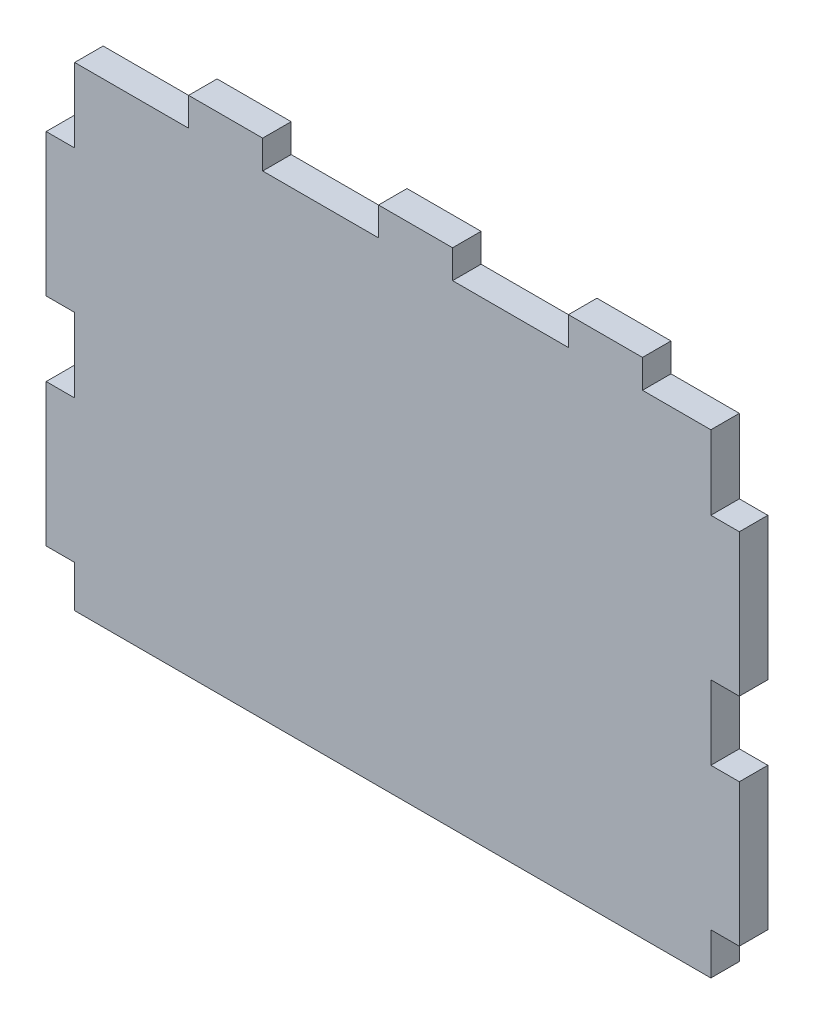
ISO-10303-21;
HEADER;
FILE_DESCRIPTION(('STEP AP214'),'2;1');
FILE_NAME('part.step','',(''),(''),'','','');
FILE_SCHEMA(('AUTOMOTIVE_DESIGN { 1 0 10303 214 1 1 1 1 }'));
ENDSEC;
DATA;
#1=APPLICATION_CONTEXT('core data for automotive mechanical design processes');
#2=APPLICATION_PROTOCOL_DEFINITION('international standard','automotive_design',2000,#1);
#3=PRODUCT_CONTEXT('',#1,'mechanical');
#4=PRODUCT('Part','Part','',(#3));
#5=PRODUCT_RELATED_PRODUCT_CATEGORY('part','',(#4));
#6=PRODUCT_DEFINITION_FORMATION('','',#4);
#7=PRODUCT_DEFINITION_CONTEXT('part definition',#1,'design');
#8=PRODUCT_DEFINITION('design','',#6,#7);
#9=PRODUCT_DEFINITION_SHAPE('','',#8);
#10=(LENGTH_UNIT() NAMED_UNIT(*) SI_UNIT(.MILLI.,.METRE.));
#11=(NAMED_UNIT(*) PLANE_ANGLE_UNIT() SI_UNIT($,.RADIAN.));
#12=(NAMED_UNIT(*) SI_UNIT($,.STERADIAN.) SOLID_ANGLE_UNIT());
#13=UNCERTAINTY_MEASURE_WITH_UNIT(LENGTH_MEASURE(1.E-05),#10,'distance_accuracy_value','');
#14=(GEOMETRIC_REPRESENTATION_CONTEXT(3) GLOBAL_UNCERTAINTY_ASSIGNED_CONTEXT((#13)) GLOBAL_UNIT_ASSIGNED_CONTEXT((#10,
#11,#12)) REPRESENTATION_CONTEXT('',''));
#15=CARTESIAN_POINT('',(0.,0.,0.));
#16=DIRECTION('',(0.,0.,1.));
#17=DIRECTION('',(1.,0.,0.));
#18=AXIS2_PLACEMENT_3D('',#15,#16,#17);
#19=CARTESIAN_POINT('',(-37.9934606481481,-6.25798611111111,0.));
#20=DIRECTION('',(1.,0.,0.));
#21=DIRECTION('',(0.,0.,-1.));
#22=AXIS2_PLACEMENT_3D('',#19,#20,#21);
#23=PLANE('',#22);
#24=DIRECTION('',(0.,0.,1.));
#25=VECTOR('',#24,1.);
#26=CARTESIAN_POINT('',(-37.9934606481481,-29.0579861111111,0.));
#27=LINE('',#26,#25);
#28=CARTESIAN_POINT('',(-37.9934606481481,-29.0579861111111,0.));
#29=VERTEX_POINT('',#28);
#30=CARTESIAN_POINT('',(-37.9934606481481,-29.0579861111111,3.));
#31=VERTEX_POINT('',#30);
#32=EDGE_CURVE('E50',#29,#31,#27,.T.);
#33=ORIENTED_EDGE('',*,*,#32,.F.);
#34=DIRECTION('',(0.,1.,0.));
#35=VECTOR('',#34,1.);
#36=CARTESIAN_POINT('',(-37.9934606481481,0.,0.));
#37=LINE('',#36,#35);
#38=CARTESIAN_POINT('',(-37.9934606481481,-33.4579861111111,0.));
#39=VERTEX_POINT('',#38);
#40=EDGE_CURVE('E11',#39,#29,#37,.T.);
#41=ORIENTED_EDGE('',*,*,#40,.F.);
#42=DIRECTION('',(0.,0.,-1.));
#43=VECTOR('',#42,1.);
#44=CARTESIAN_POINT('',(-37.9934606481481,-33.4579861111111,3.));
#45=LINE('',#44,#43);
#46=CARTESIAN_POINT('',(-37.9934606481481,-33.4579861111111,3.));
#47=VERTEX_POINT('',#46);
#48=EDGE_CURVE('E426',#47,#39,#45,.T.);
#49=ORIENTED_EDGE('',*,*,#48,.F.);
#50=DIRECTION('',(0.,1.,0.));
#51=VECTOR('',#50,1.);
#52=CARTESIAN_POINT('',(-37.9934606481481,-6.25798611111111,3.));
#53=LINE('',#52,#51);
#54=EDGE_CURVE('E420',#47,#31,#53,.T.);
#55=ORIENTED_EDGE('',*,*,#54,.T.);
#56=EDGE_LOOP('',(#33,#41,#49,#55));
#57=FACE_BOUND('',#56,.T.);
#58=ADVANCED_FACE('F35',(#57),#23,.F.);
#59=DIRECTION('',(0.,0.,-1.));
#60=VECTOR('',#59,1.);
#61=CARTESIAN_POINT('',(-37.9934606481481,-14.0579861111111,0.));
#62=LINE('',#61,#60);
#63=CARTESIAN_POINT('',(-37.9934606481481,-14.0579861111111,3.));
#64=VERTEX_POINT('',#63);
#65=CARTESIAN_POINT('',(-37.9934606481481,-14.0579861111111,0.));
#66=VERTEX_POINT('',#65);
#67=EDGE_CURVE('E57',#64,#66,#62,.T.);
#68=ORIENTED_EDGE('',*,*,#67,.F.);
#69=CARTESIAN_POINT('',(-37.9934606481481,-6.25798611111111,3.));
#70=VERTEX_POINT('',#69);
#71=EDGE_CURVE('E410',#64,#70,#53,.T.);
#72=ORIENTED_EDGE('',*,*,#71,.T.);
#73=DIRECTION('',(0.,0.,1.));
#74=VECTOR('',#73,1.);
#75=CARTESIAN_POINT('',(-37.9934606481481,-6.25798611111111,0.));
#76=LINE('',#75,#74);
#77=CARTESIAN_POINT('',(-37.9934606481481,-6.25798611111111,0.));
#78=VERTEX_POINT('',#77);
#79=EDGE_CURVE('E418',#78,#70,#76,.T.);
#80=ORIENTED_EDGE('',*,*,#79,.F.);
#81=EDGE_CURVE('E43',#66,#78,#37,.T.);
#82=ORIENTED_EDGE('',*,*,#81,.F.);
#83=EDGE_LOOP('',(#68,#72,#80,#82));
#84=FACE_BOUND('',#83,.T.);
#85=ADVANCED_FACE('F554',(#84),#23,.F.);
#86=CARTESIAN_POINT('',(-40.9934606481482,16.5420138888889,3.));
#87=DIRECTION('',(0.,-1.,0.));
#88=DIRECTION('',(0.,0.,-1.));
#89=AXIS2_PLACEMENT_3D('',#86,#87,#88);
#90=PLANE('',#89);
#91=DIRECTION('',(0.,0.,1.));
#92=VECTOR('',#91,1.);
#93=CARTESIAN_POINT('',(14.0065393518519,16.5420138888889,0.));
#94=LINE('',#93,#92);
#95=CARTESIAN_POINT('',(14.0065393518519,16.5420138888889,0.));
#96=VERTEX_POINT('',#95);
#97=CARTESIAN_POINT('',(14.0065393518519,16.5420138888889,3.));
#98=VERTEX_POINT('',#97);
#99=EDGE_CURVE('E265',#96,#98,#94,.T.);
#100=ORIENTED_EDGE('',*,*,#99,.F.);
#101=DIRECTION('',(-1.,0.,0.));
#102=VECTOR('',#101,1.);
#103=CARTESIAN_POINT('',(-40.9934606481482,16.5420138888889,0.));
#104=LINE('',#103,#102);
#105=CARTESIAN_POINT('',(1.80653935185186,16.5420138888889,0.));
#106=VERTEX_POINT('',#105);
#107=EDGE_CURVE('E473',#96,#106,#104,.T.);
#108=ORIENTED_EDGE('',*,*,#107,.T.);
#109=DIRECTION('',(0.,0.,-1.));
#110=VECTOR('',#109,1.);
#111=CARTESIAN_POINT('',(1.80653935185185,16.5420138888889,0.));
#112=LINE('',#111,#110);
#113=CARTESIAN_POINT('',(1.80653935185186,16.5420138888889,3.));
#114=VERTEX_POINT('',#113);
#115=EDGE_CURVE('E302',#114,#106,#112,.T.);
#116=ORIENTED_EDGE('',*,*,#115,.F.);
#117=DIRECTION('',(-1.,0.,0.));
#118=VECTOR('',#117,1.);
#119=CARTESIAN_POINT('',(-40.9934606481482,16.5420138888889,3.));
#120=LINE('',#119,#118);
#121=EDGE_CURVE('E464',#98,#114,#120,.T.);
#122=ORIENTED_EDGE('',*,*,#121,.F.);
#123=EDGE_LOOP('',(#100,#108,#116,#122));
#124=FACE_BOUND('',#123,.T.);
#125=ADVANCED_FACE('F510',(#124),#90,.F.);
#126=DIRECTION('',(0.,0.,-1.));
#127=VECTOR('',#126,1.);
#128=CARTESIAN_POINT('',(21.8065393518519,16.5420138888889,0.));
#129=LINE('',#128,#127);
#130=CARTESIAN_POINT('',(21.8065393518518,16.5420138888889,3.));
#131=VERTEX_POINT('',#130);
#132=CARTESIAN_POINT('',(21.8065393518518,16.5420138888889,0.));
#133=VERTEX_POINT('',#132);
#134=EDGE_CURVE('E268',#131,#133,#129,.T.);
#135=ORIENTED_EDGE('',*,*,#134,.F.);
#136=CARTESIAN_POINT('',(29.0065393518518,16.5420138888889,3.));
#137=VERTEX_POINT('',#136);
#138=EDGE_CURVE('E461',#137,#131,#120,.T.);
#139=ORIENTED_EDGE('',*,*,#138,.F.);
#140=DIRECTION('',(0.,0.,1.));
#141=VECTOR('',#140,1.);
#142=CARTESIAN_POINT('',(29.0065393518518,16.5420138888889,0.));
#143=LINE('',#142,#141);
#144=CARTESIAN_POINT('',(29.0065393518518,16.5420138888889,0.));
#145=VERTEX_POINT('',#144);
#146=EDGE_CURVE('E408',#145,#137,#143,.T.);
#147=ORIENTED_EDGE('',*,*,#146,.F.);
#148=EDGE_CURVE('E455',#145,#133,#104,.T.);
#149=ORIENTED_EDGE('',*,*,#148,.T.);
#150=EDGE_LOOP('',(#135,#139,#147,#149));
#151=FACE_BOUND('',#150,.T.);
#152=ADVANCED_FACE('F627',(#151),#90,.F.);
#153=DIRECTION('',(0.,0.,1.));
#154=VECTOR('',#153,1.);
#155=CARTESIAN_POINT('',(-5.99346064814814,16.5420138888889,0.));
#156=LINE('',#155,#154);
#157=CARTESIAN_POINT('',(-5.99346064814814,16.5420138888889,0.));
#158=VERTEX_POINT('',#157);
#159=CARTESIAN_POINT('',(-5.99346064814815,16.5420138888889,3.));
#160=VERTEX_POINT('',#159);
#161=EDGE_CURVE('E297',#158,#160,#156,.T.);
#162=ORIENTED_EDGE('',*,*,#161,.F.);
#163=CARTESIAN_POINT('',(-18.1934606481481,16.5420138888889,0.));
#164=VERTEX_POINT('',#163);
#165=EDGE_CURVE('E478',#158,#164,#104,.T.);
#166=ORIENTED_EDGE('',*,*,#165,.T.);
#167=DIRECTION('',(0.,0.,-1.));
#168=VECTOR('',#167,1.);
#169=CARTESIAN_POINT('',(-18.1934606481481,16.5420138888889,0.));
#170=LINE('',#169,#168);
#171=CARTESIAN_POINT('',(-18.1934606481481,16.5420138888889,3.));
#172=VERTEX_POINT('',#171);
#173=EDGE_CURVE('E329',#172,#164,#170,.T.);
#174=ORIENTED_EDGE('',*,*,#173,.F.);
#175=EDGE_CURVE('E500',#160,#172,#120,.T.);
#176=ORIENTED_EDGE('',*,*,#175,.F.);
#177=EDGE_LOOP('',(#162,#166,#174,#176));
#178=FACE_BOUND('',#177,.T.);
#179=ADVANCED_FACE('F524',(#178),#90,.F.);
#180=DIRECTION('',(0.,0.,1.));
#181=VECTOR('',#180,1.);
#182=CARTESIAN_POINT('',(-25.9934606481481,16.5420138888889,0.));
#183=LINE('',#182,#181);
#184=CARTESIAN_POINT('',(-25.9934606481481,16.5420138888889,0.));
#185=VERTEX_POINT('',#184);
#186=CARTESIAN_POINT('',(-25.9934606481481,16.5420138888889,3.));
#187=VERTEX_POINT('',#186);
#188=EDGE_CURVE('E324',#185,#187,#183,.T.);
#189=ORIENTED_EDGE('',*,*,#188,.F.);
#190=CARTESIAN_POINT('',(-37.9934606481481,16.5420138888889,0.));
#191=VERTEX_POINT('',#190);
#192=EDGE_CURVE('E474',#185,#191,#104,.T.);
#193=ORIENTED_EDGE('',*,*,#192,.T.);
#194=DIRECTION('',(0.,0.,1.));
#195=VECTOR('',#194,1.);
#196=CARTESIAN_POINT('',(-37.9934606481481,16.5420138888889,0.));
#197=LINE('',#196,#195);
#198=CARTESIAN_POINT('',(-37.9934606481481,16.5420138888889,3.));
#199=VERTEX_POINT('',#198);
#200=EDGE_CURVE('E444',#191,#199,#197,.T.);
#201=ORIENTED_EDGE('',*,*,#200,.T.);
#202=EDGE_CURVE('E465',#187,#199,#120,.T.);
#203=ORIENTED_EDGE('',*,*,#202,.F.);
#204=EDGE_LOOP('',(#189,#193,#201,#203));
#205=FACE_BOUND('',#204,.T.);
#206=ADVANCED_FACE('F537',(#205),#90,.F.);
#207=CARTESIAN_POINT('',(32.0065393518518,16.5420138888889,3.));
#208=DIRECTION('',(-1.,0.,0.));
#209=DIRECTION('',(0.,0.,1.));
#210=AXIS2_PLACEMENT_3D('',#207,#208,#209);
#211=PLANE('',#210);
#212=DIRECTION('',(0.,1.,0.));
#213=VECTOR('',#212,1.);
#214=CARTESIAN_POINT('',(32.0065393518518,16.5420138888889,3.));
#215=LINE('',#214,#213);
#216=CARTESIAN_POINT('',(32.0065393518518,-6.25798611111111,3.));
#217=VERTEX_POINT('',#216);
#218=CARTESIAN_POINT('',(32.0065393518518,8.74201388888889,3.));
#219=VERTEX_POINT('',#218);
#220=EDGE_CURVE('E458',#217,#219,#215,.T.);
#221=ORIENTED_EDGE('',*,*,#220,.F.);
#222=DIRECTION('',(0.,0.,1.));
#223=VECTOR('',#222,1.);
#224=CARTESIAN_POINT('',(32.0065393518518,-6.25798611111111,0.));
#225=LINE('',#224,#223);
#226=CARTESIAN_POINT('',(32.0065393518518,-6.25798611111111,0.));
#227=VERTEX_POINT('',#226);
#228=EDGE_CURVE('E374',#227,#217,#225,.T.);
#229=ORIENTED_EDGE('',*,*,#228,.F.);
#230=DIRECTION('',(0.,1.,0.));
#231=VECTOR('',#230,1.);
#232=CARTESIAN_POINT('',(32.0065393518518,16.5420138888889,0.));
#233=LINE('',#232,#231);
#234=CARTESIAN_POINT('',(32.0065393518518,8.74201388888889,0.));
#235=VERTEX_POINT('',#234);
#236=EDGE_CURVE('E471',#227,#235,#233,.T.);
#237=ORIENTED_EDGE('',*,*,#236,.T.);
#238=DIRECTION('',(0.,0.,1.));
#239=VECTOR('',#238,1.);
#240=CARTESIAN_POINT('',(32.0065393518518,8.74201388888889,0.));
#241=LINE('',#240,#239);
#242=EDGE_CURVE('E411',#235,#219,#241,.T.);
#243=ORIENTED_EDGE('',*,*,#242,.T.);
#244=EDGE_LOOP('',(#221,#229,#237,#243));
#245=FACE_BOUND('',#244,.T.);
#246=ADVANCED_FACE('F603',(#245),#211,.F.);
#247=CARTESIAN_POINT('',(-40.9934606481482,16.5420138888889,3.));
#248=DIRECTION('',(1.,0.,0.));
#249=DIRECTION('',(0.,0.,-1.));
#250=AXIS2_PLACEMENT_3D('',#247,#248,#249);
#251=PLANE('',#250);
#252=DIRECTION('',(0.,-1.,0.));
#253=VECTOR('',#252,1.);
#254=CARTESIAN_POINT('',(-40.9934606481482,16.5420138888889,0.));
#255=LINE('',#254,#253);
#256=CARTESIAN_POINT('',(-40.9934606481482,8.74201388888889,0.));
#257=VERTEX_POINT('',#256);
#258=CARTESIAN_POINT('',(-40.9934606481482,-6.25798611111111,0.));
#259=VERTEX_POINT('',#258);
#260=EDGE_CURVE('E447',#257,#259,#255,.T.);
#261=ORIENTED_EDGE('',*,*,#260,.T.);
#262=DIRECTION('',(0.,0.,1.));
#263=VECTOR('',#262,1.);
#264=CARTESIAN_POINT('',(-40.9934606481482,-6.25798611111111,0.));
#265=LINE('',#264,#263);
#266=CARTESIAN_POINT('',(-40.9934606481482,-6.25798611111111,3.));
#267=VERTEX_POINT('',#266);
#268=EDGE_CURVE('E423',#259,#267,#265,.T.);
#269=ORIENTED_EDGE('',*,*,#268,.T.);
#270=DIRECTION('',(0.,-1.,0.));
#271=VECTOR('',#270,1.);
#272=CARTESIAN_POINT('',(-40.9934606481482,16.5420138888889,3.));
#273=LINE('',#272,#271);
#274=CARTESIAN_POINT('',(-40.9934606481482,8.74201388888889,3.));
#275=VERTEX_POINT('',#274);
#276=EDGE_CURVE('E451',#275,#267,#273,.T.);
#277=ORIENTED_EDGE('',*,*,#276,.F.);
#278=DIRECTION('',(0.,0.,1.));
#279=VECTOR('',#278,1.);
#280=CARTESIAN_POINT('',(-40.9934606481482,8.74201388888889,0.));
#281=LINE('',#280,#279);
#282=EDGE_CURVE('E439',#257,#275,#281,.T.);
#283=ORIENTED_EDGE('',*,*,#282,.F.);
#284=EDGE_LOOP('',(#261,#269,#277,#283));
#285=FACE_BOUND('',#284,.T.);
#286=ADVANCED_FACE('F37',(#285),#251,.F.);
#287=CARTESIAN_POINT('',(-40.9934606481482,-33.4579861111111,3.));
#288=DIRECTION('',(0.,1.,0.));
#289=DIRECTION('',(0.,0.,1.));
#290=AXIS2_PLACEMENT_3D('',#287,#288,#289);
#291=PLANE('',#290);
#292=DIRECTION('',(1.,0.,0.));
#293=VECTOR('',#292,1.);
#294=CARTESIAN_POINT('',(-40.9934606481482,-33.4579861111111,0.));
#295=LINE('',#294,#293);
#296=CARTESIAN_POINT('',(29.0065393518518,-33.4579861111111,0.));
#297=VERTEX_POINT('',#296);
#298=EDGE_CURVE('E468',#39,#297,#295,.T.);
#299=ORIENTED_EDGE('',*,*,#298,.T.);
#300=DIRECTION('',(0.,0.,1.));
#301=VECTOR('',#300,1.);
#302=CARTESIAN_POINT('',(29.0065393518518,-33.4579861111111,3.));
#303=LINE('',#302,#301);
#304=CARTESIAN_POINT('',(29.0065393518518,-33.4579861111111,3.));
#305=VERTEX_POINT('',#304);
#306=EDGE_CURVE('E373',#297,#305,#303,.T.);
#307=ORIENTED_EDGE('',*,*,#306,.T.);
#308=DIRECTION('',(1.,0.,0.));
#309=VECTOR('',#308,1.);
#310=CARTESIAN_POINT('',(-40.9934606481482,-33.4579861111111,3.));
#311=LINE('',#310,#309);
#312=EDGE_CURVE('E454',#47,#305,#311,.T.);
#313=ORIENTED_EDGE('',*,*,#312,.F.);
#314=ORIENTED_EDGE('',*,*,#48,.T.);
#315=EDGE_LOOP('',(#299,#307,#313,#314));
#316=FACE_BOUND('',#315,.T.);
#317=ADVANCED_FACE('F567',(#316),#291,.F.);
#318=CARTESIAN_POINT('',(32.0065393518518,-29.0579861111111,0.));
#319=VERTEX_POINT('',#318);
#320=CARTESIAN_POINT('',(32.0065393518518,-14.0579861111111,0.));
#321=VERTEX_POINT('',#320);
#322=EDGE_CURVE('E472',#319,#321,#233,.T.);
#323=ORIENTED_EDGE('',*,*,#322,.T.);
#324=DIRECTION('',(0.,0.,1.));
#325=VECTOR('',#324,1.);
#326=CARTESIAN_POINT('',(32.0065393518518,-14.0579861111111,0.));
#327=LINE('',#326,#325);
#328=CARTESIAN_POINT('',(32.0065393518518,-14.0579861111111,3.));
#329=VERTEX_POINT('',#328);
#330=EDGE_CURVE('E376',#321,#329,#327,.T.);
#331=ORIENTED_EDGE('',*,*,#330,.T.);
#332=CARTESIAN_POINT('',(32.0065393518518,-29.0579861111111,3.));
#333=VERTEX_POINT('',#332);
#334=EDGE_CURVE('E460',#333,#329,#215,.T.);
#335=ORIENTED_EDGE('',*,*,#334,.F.);
#336=DIRECTION('',(0.,0.,1.));
#337=VECTOR('',#336,1.);
#338=CARTESIAN_POINT('',(32.0065393518518,-29.0579861111111,0.));
#339=LINE('',#338,#337);
#340=EDGE_CURVE('E387',#319,#333,#339,.T.);
#341=ORIENTED_EDGE('',*,*,#340,.F.);
#342=EDGE_LOOP('',(#323,#331,#335,#341));
#343=FACE_BOUND('',#342,.T.);
#344=ADVANCED_FACE('F486',(#343),#211,.F.);
#345=CARTESIAN_POINT('',(0.,0.,3.));
#346=DIRECTION('',(0.,0.,1.));
#347=DIRECTION('',(1.,0.,0.));
#348=AXIS2_PLACEMENT_3D('',#345,#346,#347);
#349=PLANE('',#348);
#350=ORIENTED_EDGE('',*,*,#54,.F.);
#351=ORIENTED_EDGE('',*,*,#312,.T.);
#352=DIRECTION('',(0.,-1.,0.));
#353=VECTOR('',#352,1.);
#354=CARTESIAN_POINT('',(29.0065393518518,-29.0579861111111,3.));
#355=LINE('',#354,#353);
#356=CARTESIAN_POINT('',(29.0065393518518,-29.0579861111111,3.));
#357=VERTEX_POINT('',#356);
#358=EDGE_CURVE('E351',#357,#305,#355,.T.);
#359=ORIENTED_EDGE('',*,*,#358,.F.);
#360=DIRECTION('',(-1.,0.,0.));
#361=VECTOR('',#360,1.);
#362=CARTESIAN_POINT('',(29.0065393518518,-29.0579861111111,3.));
#363=LINE('',#362,#361);
#364=EDGE_CURVE('E384',#333,#357,#363,.T.);
#365=ORIENTED_EDGE('',*,*,#364,.F.);
#366=ORIENTED_EDGE('',*,*,#334,.T.);
#367=DIRECTION('',(1.,0.,0.));
#368=VECTOR('',#367,1.);
#369=CARTESIAN_POINT('',(29.0065393518518,-14.0579861111111,3.));
#370=LINE('',#369,#368);
#371=CARTESIAN_POINT('',(29.0065393518518,-14.0579861111111,3.));
#372=VERTEX_POINT('',#371);
#373=EDGE_CURVE('E366',#372,#329,#370,.T.);
#374=ORIENTED_EDGE('',*,*,#373,.F.);
#375=DIRECTION('',(0.,-1.,0.));
#376=VECTOR('',#375,1.);
#377=CARTESIAN_POINT('',(29.0065393518518,-6.25798611111111,3.));
#378=LINE('',#377,#376);
#379=CARTESIAN_POINT('',(29.0065393518518,-6.25798611111111,3.));
#380=VERTEX_POINT('',#379);
#381=EDGE_CURVE('E363',#380,#372,#378,.T.);
#382=ORIENTED_EDGE('',*,*,#381,.F.);
#383=DIRECTION('',(-1.,0.,0.));
#384=VECTOR('',#383,1.);
#385=CARTESIAN_POINT('',(29.0065393518518,-6.25798611111111,3.));
#386=LINE('',#385,#384);
#387=EDGE_CURVE('E356',#217,#380,#386,.T.);
#388=ORIENTED_EDGE('',*,*,#387,.F.);
#389=ORIENTED_EDGE('',*,*,#220,.T.);
#390=DIRECTION('',(1.,0.,0.));
#391=VECTOR('',#390,1.);
#392=CARTESIAN_POINT('',(29.0065393518518,8.74201388888889,3.));
#393=LINE('',#392,#391);
#394=CARTESIAN_POINT('',(29.0065393518518,8.74201388888889,3.));
#395=VERTEX_POINT('',#394);
#396=EDGE_CURVE('E400',#395,#219,#393,.T.);
#397=ORIENTED_EDGE('',*,*,#396,.F.);
#398=DIRECTION('',(0.,-1.,0.));
#399=VECTOR('',#398,1.);
#400=CARTESIAN_POINT('',(29.0065393518518,16.5420138888889,3.));
#401=LINE('',#400,#399);
#402=EDGE_CURVE('E395',#137,#395,#401,.T.);
#403=ORIENTED_EDGE('',*,*,#402,.F.);
#404=ORIENTED_EDGE('',*,*,#138,.T.);
#405=DIRECTION('',(0.,-1.,0.));
#406=VECTOR('',#405,1.);
#407=CARTESIAN_POINT('',(21.8065393518519,19.5420138888889,3.));
#408=LINE('',#407,#406);
#409=CARTESIAN_POINT('',(21.8065393518519,19.5420138888889,3.));
#410=VERTEX_POINT('',#409);
#411=EDGE_CURVE('E291',#410,#131,#408,.T.);
#412=ORIENTED_EDGE('',*,*,#411,.F.);
#413=DIRECTION('',(1.,0.,0.));
#414=VECTOR('',#413,1.);
#415=CARTESIAN_POINT('',(14.0065393518519,19.5420138888889,3.));
#416=LINE('',#415,#414);
#417=CARTESIAN_POINT('',(14.0065393518519,19.5420138888889,3.));
#418=VERTEX_POINT('',#417);
#419=EDGE_CURVE('E277',#418,#410,#416,.T.);
#420=ORIENTED_EDGE('',*,*,#419,.F.);
#421=DIRECTION('',(0.,-1.,0.));
#422=VECTOR('',#421,1.);
#423=CARTESIAN_POINT('',(14.0065393518519,19.5420138888889,3.));
#424=LINE('',#423,#422);
#425=EDGE_CURVE('E294',#418,#98,#424,.T.);
#426=ORIENTED_EDGE('',*,*,#425,.T.);
#427=ORIENTED_EDGE('',*,*,#121,.T.);
#428=DIRECTION('',(0.,-1.,0.));
#429=VECTOR('',#428,1.);
#430=CARTESIAN_POINT('',(1.80653935185185,19.5420138888889,3.));
#431=LINE('',#430,#429);
#432=CARTESIAN_POINT('',(1.80653935185185,19.5420138888889,3.));
#433=VERTEX_POINT('',#432);
#434=EDGE_CURVE('E318',#433,#114,#431,.T.);
#435=ORIENTED_EDGE('',*,*,#434,.F.);
#436=DIRECTION('',(1.,0.,0.));
#437=VECTOR('',#436,1.);
#438=CARTESIAN_POINT('',(-5.99346064814815,19.5420138888889,3.));
#439=LINE('',#438,#437);
#440=CARTESIAN_POINT('',(-5.99346064814815,19.5420138888889,3.));
#441=VERTEX_POINT('',#440);
#442=EDGE_CURVE('E301',#441,#433,#439,.T.);
#443=ORIENTED_EDGE('',*,*,#442,.F.);
#444=DIRECTION('',(0.,-1.,0.));
#445=VECTOR('',#444,1.);
#446=CARTESIAN_POINT('',(-5.99346064814815,19.5420138888889,3.));
#447=LINE('',#446,#445);
#448=EDGE_CURVE('E321',#441,#160,#447,.T.);
#449=ORIENTED_EDGE('',*,*,#448,.T.);
#450=ORIENTED_EDGE('',*,*,#175,.T.);
#451=DIRECTION('',(0.,-1.,0.));
#452=VECTOR('',#451,1.);
#453=CARTESIAN_POINT('',(-18.1934606481481,19.5420138888889,3.));
#454=LINE('',#453,#452);
#455=CARTESIAN_POINT('',(-18.1934606481481,19.5420138888889,3.));
#456=VERTEX_POINT('',#455);
#457=EDGE_CURVE('E345',#456,#172,#454,.T.);
#458=ORIENTED_EDGE('',*,*,#457,.F.);
#459=DIRECTION('',(1.,0.,0.));
#460=VECTOR('',#459,1.);
#461=CARTESIAN_POINT('',(-25.9934606481481,19.5420138888889,3.));
#462=LINE('',#461,#460);
#463=CARTESIAN_POINT('',(-25.9934606481481,19.5420138888889,3.));
#464=VERTEX_POINT('',#463);
#465=EDGE_CURVE('E328',#464,#456,#462,.T.);
#466=ORIENTED_EDGE('',*,*,#465,.F.);
#467=DIRECTION('',(0.,-1.,0.));
#468=VECTOR('',#467,1.);
#469=CARTESIAN_POINT('',(-25.9934606481481,19.5420138888889,3.));
#470=LINE('',#469,#468);
#471=EDGE_CURVE('E348',#464,#187,#470,.T.);
#472=ORIENTED_EDGE('',*,*,#471,.T.);
#473=ORIENTED_EDGE('',*,*,#202,.T.);
#474=DIRECTION('',(0.,1.,0.));
#475=VECTOR('',#474,1.);
#476=CARTESIAN_POINT('',(-37.9934606481481,16.5420138888889,3.));
#477=LINE('',#476,#475);
#478=CARTESIAN_POINT('',(-37.9934606481481,8.74201388888889,3.));
#479=VERTEX_POINT('',#478);
#480=EDGE_CURVE('E436',#479,#199,#477,.T.);
#481=ORIENTED_EDGE('',*,*,#480,.F.);
#482=DIRECTION('',(1.,0.,0.));
#483=VECTOR('',#482,1.);
#484=CARTESIAN_POINT('',(-40.9934606481482,8.74201388888889,3.));
#485=LINE('',#484,#483);
#486=EDGE_CURVE('E431',#275,#479,#485,.T.);
#487=ORIENTED_EDGE('',*,*,#486,.F.);
#488=ORIENTED_EDGE('',*,*,#276,.T.);
#489=DIRECTION('',(-1.,0.,0.));
#490=VECTOR('',#489,1.);
#491=CARTESIAN_POINT('',(-40.9934606481482,-6.25798611111111,3.));
#492=LINE('',#491,#490);
#493=EDGE_CURVE('E419',#70,#267,#492,.T.);
#494=ORIENTED_EDGE('',*,*,#493,.F.);
#495=ORIENTED_EDGE('',*,*,#71,.F.);
#496=DIRECTION('',(1.,0.,0.));
#497=VECTOR('',#496,1.);
#498=CARTESIAN_POINT('',(-40.9934606481482,-14.0579861111111,3.));
#499=LINE('',#498,#497);
#500=CARTESIAN_POINT('',(-40.9934606481482,-14.0579861111111,3.));
#501=VERTEX_POINT('',#500);
#502=EDGE_CURVE('E270',#501,#64,#499,.T.);
#503=ORIENTED_EDGE('',*,*,#502,.F.);
#504=DIRECTION('',(0.,1.,0.));
#505=VECTOR('',#504,1.);
#506=CARTESIAN_POINT('',(-40.9934606481482,-14.0579861111111,3.));
#507=LINE('',#506,#505);
#508=CARTESIAN_POINT('',(-40.9934606481482,-29.0579861111111,3.));
#509=VERTEX_POINT('',#508);
#510=EDGE_CURVE('E252',#509,#501,#507,.T.);
#511=ORIENTED_EDGE('',*,*,#510,.F.);
#512=DIRECTION('',(1.,0.,0.));
#513=VECTOR('',#512,1.);
#514=CARTESIAN_POINT('',(-40.9934606481482,-29.0579861111111,3.));
#515=LINE('',#514,#513);
#516=EDGE_CURVE('E249',#509,#31,#515,.T.);
#517=ORIENTED_EDGE('',*,*,#516,.T.);
#518=EDGE_LOOP('',(#350,#351,#359,#365,#366,#374,#382,#388,#389,#397,#403,#404,#412,#420,#426,
#427,#435,#443,#449,#450,#458,#466,#472,#473,#481,#487,#488,#494,#495,#503,#511,#517));
#519=FACE_BOUND('',#518,.T.);
#520=ADVANCED_FACE('F496',(#519),#349,.T.);
#521=CARTESIAN_POINT('',(0.,0.,0.));
#522=DIRECTION('',(0.,0.,1.));
#523=DIRECTION('',(1.,0.,0.));
#524=AXIS2_PLACEMENT_3D('',#521,#522,#523);
#525=PLANE('',#524);
#526=ORIENTED_EDGE('',*,*,#40,.T.);
#527=DIRECTION('',(1.,0.,0.));
#528=VECTOR('',#527,1.);
#529=CARTESIAN_POINT('',(-40.9934606481482,-29.0579861111111,0.));
#530=LINE('',#529,#528);
#531=CARTESIAN_POINT('',(-40.9934606481482,-29.0579861111111,0.));
#532=VERTEX_POINT('',#531);
#533=EDGE_CURVE('E247',#532,#29,#530,.T.);
#534=ORIENTED_EDGE('',*,*,#533,.F.);
#535=DIRECTION('',(0.,-1.,0.));
#536=VECTOR('',#535,1.);
#537=CARTESIAN_POINT('',(-40.9934606481482,-14.0579861111111,0.));
#538=LINE('',#537,#536);
#539=CARTESIAN_POINT('',(-40.9934606481482,-14.0579861111111,0.));
#540=VERTEX_POINT('',#539);
#541=EDGE_CURVE('E253',#540,#532,#538,.T.);
#542=ORIENTED_EDGE('',*,*,#541,.F.);
#543=DIRECTION('',(1.,0.,0.));
#544=VECTOR('',#543,1.);
#545=CARTESIAN_POINT('',(-40.9934606481482,-14.0579861111111,0.));
#546=LINE('',#545,#544);
#547=EDGE_CURVE('E553',#540,#66,#546,.T.);
#548=ORIENTED_EDGE('',*,*,#547,.T.);
#549=ORIENTED_EDGE('',*,*,#81,.T.);
#550=DIRECTION('',(-1.,0.,0.));
#551=VECTOR('',#550,1.);
#552=CARTESIAN_POINT('',(-40.9934606481482,-6.25798611111111,0.));
#553=LINE('',#552,#551);
#554=EDGE_CURVE('E415',#78,#259,#553,.T.);
#555=ORIENTED_EDGE('',*,*,#554,.T.);
#556=ORIENTED_EDGE('',*,*,#260,.F.);
#557=DIRECTION('',(1.,0.,0.));
#558=VECTOR('',#557,1.);
#559=CARTESIAN_POINT('',(-40.9934606481482,8.74201388888889,0.));
#560=LINE('',#559,#558);
#561=CARTESIAN_POINT('',(-37.9934606481481,8.74201388888889,0.));
#562=VERTEX_POINT('',#561);
#563=EDGE_CURVE('E432',#257,#562,#560,.T.);
#564=ORIENTED_EDGE('',*,*,#563,.T.);
#565=DIRECTION('',(0.,1.,0.));
#566=VECTOR('',#565,1.);
#567=CARTESIAN_POINT('',(-37.9934606481481,16.5420138888889,0.));
#568=LINE('',#567,#566);
#569=EDGE_CURVE('E435',#562,#191,#568,.T.);
#570=ORIENTED_EDGE('',*,*,#569,.T.);
#571=ORIENTED_EDGE('',*,*,#192,.F.);
#572=DIRECTION('',(0.,-1.,0.));
#573=VECTOR('',#572,1.);
#574=CARTESIAN_POINT('',(-25.9934606481481,19.5420138888889,0.));
#575=LINE('',#574,#573);
#576=CARTESIAN_POINT('',(-25.9934606481481,19.5420138888889,0.));
#577=VERTEX_POINT('',#576);
#578=EDGE_CURVE('E335',#577,#185,#575,.T.);
#579=ORIENTED_EDGE('',*,*,#578,.F.);
#580=DIRECTION('',(-1.,0.,0.));
#581=VECTOR('',#580,1.);
#582=CARTESIAN_POINT('',(-25.9934606481481,19.5420138888889,0.));
#583=LINE('',#582,#581);
#584=CARTESIAN_POINT('',(-18.1934606481481,19.5420138888889,0.));
#585=VERTEX_POINT('',#584);
#586=EDGE_CURVE('E333',#585,#577,#583,.T.);
#587=ORIENTED_EDGE('',*,*,#586,.F.);
#588=DIRECTION('',(0.,-1.,0.));
#589=VECTOR('',#588,1.);
#590=CARTESIAN_POINT('',(-18.1934606481481,19.5420138888889,0.));
#591=LINE('',#590,#589);
#592=EDGE_CURVE('E342',#585,#164,#591,.T.);
#593=ORIENTED_EDGE('',*,*,#592,.T.);
#594=ORIENTED_EDGE('',*,*,#165,.F.);
#595=DIRECTION('',(0.,-1.,0.));
#596=VECTOR('',#595,1.);
#597=CARTESIAN_POINT('',(-5.99346064814814,19.5420138888889,0.));
#598=LINE('',#597,#596);
#599=CARTESIAN_POINT('',(-5.99346064814814,19.5420138888889,0.));
#600=VERTEX_POINT('',#599);
#601=EDGE_CURVE('E308',#600,#158,#598,.T.);
#602=ORIENTED_EDGE('',*,*,#601,.F.);
#603=DIRECTION('',(-1.,0.,0.));
#604=VECTOR('',#603,1.);
#605=CARTESIAN_POINT('',(-5.99346064814814,19.5420138888889,0.));
#606=LINE('',#605,#604);
#607=CARTESIAN_POINT('',(1.80653935185185,19.5420138888889,0.));
#608=VERTEX_POINT('',#607);
#609=EDGE_CURVE('E306',#608,#600,#606,.T.);
#610=ORIENTED_EDGE('',*,*,#609,.F.);
#611=DIRECTION('',(0.,-1.,0.));
#612=VECTOR('',#611,1.);
#613=CARTESIAN_POINT('',(1.80653935185185,19.5420138888889,0.));
#614=LINE('',#613,#612);
#615=EDGE_CURVE('E315',#608,#106,#614,.T.);
#616=ORIENTED_EDGE('',*,*,#615,.T.);
#617=ORIENTED_EDGE('',*,*,#107,.F.);
#618=DIRECTION('',(0.,-1.,0.));
#619=VECTOR('',#618,1.);
#620=CARTESIAN_POINT('',(14.0065393518519,19.5420138888889,0.));
#621=LINE('',#620,#619);
#622=CARTESIAN_POINT('',(14.0065393518519,19.5420138888889,0.));
#623=VERTEX_POINT('',#622);
#624=EDGE_CURVE('E282',#623,#96,#621,.T.);
#625=ORIENTED_EDGE('',*,*,#624,.F.);
#626=DIRECTION('',(-1.,0.,0.));
#627=VECTOR('',#626,1.);
#628=CARTESIAN_POINT('',(14.0065393518519,19.5420138888889,0.));
#629=LINE('',#628,#627);
#630=CARTESIAN_POINT('',(21.8065393518519,19.5420138888889,0.));
#631=VERTEX_POINT('',#630);
#632=EDGE_CURVE('E281',#631,#623,#629,.T.);
#633=ORIENTED_EDGE('',*,*,#632,.F.);
#634=DIRECTION('',(0.,-1.,0.));
#635=VECTOR('',#634,1.);
#636=CARTESIAN_POINT('',(21.8065393518519,19.5420138888889,0.));
#637=LINE('',#636,#635);
#638=EDGE_CURVE('E288',#631,#133,#637,.T.);
#639=ORIENTED_EDGE('',*,*,#638,.T.);
#640=ORIENTED_EDGE('',*,*,#148,.F.);
#641=DIRECTION('',(0.,-1.,0.));
#642=VECTOR('',#641,1.);
#643=CARTESIAN_POINT('',(29.0065393518518,16.5420138888889,0.));
#644=LINE('',#643,#642);
#645=CARTESIAN_POINT('',(29.0065393518518,8.74201388888889,0.));
#646=VERTEX_POINT('',#645);
#647=EDGE_CURVE('E396',#145,#646,#644,.T.);
#648=ORIENTED_EDGE('',*,*,#647,.T.);
#649=DIRECTION('',(1.,0.,0.));
#650=VECTOR('',#649,1.);
#651=CARTESIAN_POINT('',(29.0065393518518,8.74201388888889,0.));
#652=LINE('',#651,#650);
#653=EDGE_CURVE('E399',#646,#235,#652,.T.);
#654=ORIENTED_EDGE('',*,*,#653,.T.);
#655=ORIENTED_EDGE('',*,*,#236,.F.);
#656=DIRECTION('',(-1.,0.,0.));
#657=VECTOR('',#656,1.);
#658=CARTESIAN_POINT('',(29.0065393518518,-6.25798611111111,0.));
#659=LINE('',#658,#657);
#660=CARTESIAN_POINT('',(29.0065393518518,-6.25798611111111,0.));
#661=VERTEX_POINT('',#660);
#662=EDGE_CURVE('E359',#227,#661,#659,.T.);
#663=ORIENTED_EDGE('',*,*,#662,.T.);
#664=DIRECTION('',(0.,-1.,0.));
#665=VECTOR('',#664,1.);
#666=CARTESIAN_POINT('',(29.0065393518518,-6.25798611111111,0.));
#667=LINE('',#666,#665);
#668=CARTESIAN_POINT('',(29.0065393518518,-14.0579861111111,0.));
#669=VERTEX_POINT('',#668);
#670=EDGE_CURVE('E352',#661,#669,#667,.T.);
#671=ORIENTED_EDGE('',*,*,#670,.T.);
#672=DIRECTION('',(1.,0.,0.));
#673=VECTOR('',#672,1.);
#674=CARTESIAN_POINT('',(29.0065393518518,-14.0579861111111,0.));
#675=LINE('',#674,#673);
#676=EDGE_CURVE('E355',#669,#321,#675,.T.);
#677=ORIENTED_EDGE('',*,*,#676,.T.);
#678=ORIENTED_EDGE('',*,*,#322,.F.);
#679=DIRECTION('',(-1.,0.,0.));
#680=VECTOR('',#679,1.);
#681=CARTESIAN_POINT('',(29.0065393518518,-29.0579861111111,0.));
#682=LINE('',#681,#680);
#683=CARTESIAN_POINT('',(29.0065393518518,-29.0579861111111,0.));
#684=VERTEX_POINT('',#683);
#685=EDGE_CURVE('E383',#319,#684,#682,.T.);
#686=ORIENTED_EDGE('',*,*,#685,.T.);
#687=DIRECTION('',(0.,-1.,0.));
#688=VECTOR('',#687,1.);
#689=CARTESIAN_POINT('',(29.0065393518518,-29.0579861111111,0.));
#690=LINE('',#689,#688);
#691=EDGE_CURVE('E380',#684,#297,#690,.T.);
#692=ORIENTED_EDGE('',*,*,#691,.T.);
#693=ORIENTED_EDGE('',*,*,#298,.F.);
#694=EDGE_LOOP('',(#526,#534,#542,#548,#549,#555,#556,#564,#570,#571,#579,#587,#593,#594,#602,
#610,#616,#617,#625,#633,#639,#640,#648,#654,#655,#663,#671,#677,#678,#686,#692,#693));
#695=FACE_BOUND('',#694,.T.);
#696=ADVANCED_FACE('F263',(#695),#525,.F.);
#697=CARTESIAN_POINT('',(-37.9934606481481,16.5420138888889,0.));
#698=DIRECTION('',(1.,0.,0.));
#699=DIRECTION('',(0.,0.,-1.));
#700=AXIS2_PLACEMENT_3D('',#697,#698,#699);
#701=PLANE('',#700);
#702=ORIENTED_EDGE('',*,*,#480,.T.);
#703=ORIENTED_EDGE('',*,*,#200,.F.);
#704=ORIENTED_EDGE('',*,*,#569,.F.);
#705=DIRECTION('',(0.,0.,1.));
#706=VECTOR('',#705,1.);
#707=CARTESIAN_POINT('',(-37.9934606481481,8.74201388888889,0.));
#708=LINE('',#707,#706);
#709=EDGE_CURVE('E448',#562,#479,#708,.T.);
#710=ORIENTED_EDGE('',*,*,#709,.T.);
#711=EDGE_LOOP('',(#702,#703,#704,#710));
#712=FACE_BOUND('',#711,.T.);
#713=ADVANCED_FACE('F541',(#712),#701,.F.);
#714=CARTESIAN_POINT('',(-40.9934606481482,8.74201388888889,0.));
#715=DIRECTION('',(0.,-1.,0.));
#716=DIRECTION('',(0.,0.,-1.));
#717=AXIS2_PLACEMENT_3D('',#714,#715,#716);
#718=PLANE('',#717);
#719=ORIENTED_EDGE('',*,*,#486,.T.);
#720=ORIENTED_EDGE('',*,*,#709,.F.);
#721=ORIENTED_EDGE('',*,*,#563,.F.);
#722=ORIENTED_EDGE('',*,*,#282,.T.);
#723=EDGE_LOOP('',(#719,#720,#721,#722));
#724=FACE_BOUND('',#723,.T.);
#725=ADVANCED_FACE('F543',(#724),#718,.F.);
#726=CARTESIAN_POINT('',(-40.9934606481482,-6.25798611111111,0.));
#727=DIRECTION('',(0.,1.,0.));
#728=DIRECTION('',(0.,0.,1.));
#729=AXIS2_PLACEMENT_3D('',#726,#727,#728);
#730=PLANE('',#729);
#731=ORIENTED_EDGE('',*,*,#493,.T.);
#732=ORIENTED_EDGE('',*,*,#268,.F.);
#733=ORIENTED_EDGE('',*,*,#554,.F.);
#734=ORIENTED_EDGE('',*,*,#79,.T.);
#735=EDGE_LOOP('',(#731,#732,#733,#734));
#736=FACE_BOUND('',#735,.T.);
#737=ADVANCED_FACE('F551',(#736),#730,.F.);
#738=CARTESIAN_POINT('',(29.0065393518518,16.5420138888889,0.));
#739=DIRECTION('',(-1.,0.,0.));
#740=DIRECTION('',(0.,0.,1.));
#741=AXIS2_PLACEMENT_3D('',#738,#739,#740);
#742=PLANE('',#741);
#743=ORIENTED_EDGE('',*,*,#402,.T.);
#744=DIRECTION('',(0.,0.,1.));
#745=VECTOR('',#744,1.);
#746=CARTESIAN_POINT('',(29.0065393518518,8.74201388888889,0.));
#747=LINE('',#746,#745);
#748=EDGE_CURVE('E403',#646,#395,#747,.T.);
#749=ORIENTED_EDGE('',*,*,#748,.F.);
#750=ORIENTED_EDGE('',*,*,#647,.F.);
#751=ORIENTED_EDGE('',*,*,#146,.T.);
#752=EDGE_LOOP('',(#743,#749,#750,#751));
#753=FACE_BOUND('',#752,.T.);
#754=ADVANCED_FACE('F624',(#753),#742,.F.);
#755=CARTESIAN_POINT('',(29.0065393518518,8.74201388888889,0.));
#756=DIRECTION('',(0.,-1.,0.));
#757=DIRECTION('',(0.,0.,-1.));
#758=AXIS2_PLACEMENT_3D('',#755,#756,#757);
#759=PLANE('',#758);
#760=ORIENTED_EDGE('',*,*,#396,.T.);
#761=ORIENTED_EDGE('',*,*,#242,.F.);
#762=ORIENTED_EDGE('',*,*,#653,.F.);
#763=ORIENTED_EDGE('',*,*,#748,.T.);
#764=EDGE_LOOP('',(#760,#761,#762,#763));
#765=FACE_BOUND('',#764,.T.);
#766=ADVANCED_FACE('F583',(#765),#759,.F.);
#767=CARTESIAN_POINT('',(29.0065393518518,-29.0579861111111,0.));
#768=DIRECTION('',(-1.,0.,0.));
#769=DIRECTION('',(0.,0.,1.));
#770=AXIS2_PLACEMENT_3D('',#767,#768,#769);
#771=PLANE('',#770);
#772=ORIENTED_EDGE('',*,*,#691,.F.);
#773=DIRECTION('',(0.,0.,1.));
#774=VECTOR('',#773,1.);
#775=CARTESIAN_POINT('',(29.0065393518518,-29.0579861111111,0.));
#776=LINE('',#775,#774);
#777=EDGE_CURVE('E367',#684,#357,#776,.T.);
#778=ORIENTED_EDGE('',*,*,#777,.T.);
#779=ORIENTED_EDGE('',*,*,#358,.T.);
#780=ORIENTED_EDGE('',*,*,#306,.F.);
#781=EDGE_LOOP('',(#772,#778,#779,#780));
#782=FACE_BOUND('',#781,.T.);
#783=ADVANCED_FACE('F569',(#782),#771,.F.);
#784=CARTESIAN_POINT('',(29.0065393518518,-29.0579861111111,0.));
#785=DIRECTION('',(0.,1.,0.));
#786=DIRECTION('',(0.,0.,1.));
#787=AXIS2_PLACEMENT_3D('',#784,#785,#786);
#788=PLANE('',#787);
#789=ORIENTED_EDGE('',*,*,#364,.T.);
#790=ORIENTED_EDGE('',*,*,#777,.F.);
#791=ORIENTED_EDGE('',*,*,#685,.F.);
#792=ORIENTED_EDGE('',*,*,#340,.T.);
#793=EDGE_LOOP('',(#789,#790,#791,#792));
#794=FACE_BOUND('',#793,.T.);
#795=ADVANCED_FACE('F572',(#794),#788,.F.);
#796=CARTESIAN_POINT('',(29.0065393518518,-6.25798611111111,0.));
#797=DIRECTION('',(-1.,0.,0.));
#798=DIRECTION('',(0.,0.,1.));
#799=AXIS2_PLACEMENT_3D('',#796,#797,#798);
#800=PLANE('',#799);
#801=ORIENTED_EDGE('',*,*,#381,.T.);
#802=DIRECTION('',(0.,0.,1.));
#803=VECTOR('',#802,1.);
#804=CARTESIAN_POINT('',(29.0065393518518,-14.0579861111111,0.));
#805=LINE('',#804,#803);
#806=EDGE_CURVE('E362',#669,#372,#805,.T.);
#807=ORIENTED_EDGE('',*,*,#806,.F.);
#808=ORIENTED_EDGE('',*,*,#670,.F.);
#809=DIRECTION('',(0.,0.,1.));
#810=VECTOR('',#809,1.);
#811=CARTESIAN_POINT('',(29.0065393518518,-6.25798611111111,0.));
#812=LINE('',#811,#810);
#813=EDGE_CURVE('E371',#661,#380,#812,.T.);
#814=ORIENTED_EDGE('',*,*,#813,.T.);
#815=EDGE_LOOP('',(#801,#807,#808,#814));
#816=FACE_BOUND('',#815,.T.);
#817=ADVANCED_FACE('F574',(#816),#800,.F.);
#818=CARTESIAN_POINT('',(29.0065393518518,-6.25798611111111,0.));
#819=DIRECTION('',(0.,1.,0.));
#820=DIRECTION('',(0.,0.,1.));
#821=AXIS2_PLACEMENT_3D('',#818,#819,#820);
#822=PLANE('',#821);
#823=ORIENTED_EDGE('',*,*,#387,.T.);
#824=ORIENTED_EDGE('',*,*,#813,.F.);
#825=ORIENTED_EDGE('',*,*,#662,.F.);
#826=ORIENTED_EDGE('',*,*,#228,.T.);
#827=EDGE_LOOP('',(#823,#824,#825,#826));
#828=FACE_BOUND('',#827,.T.);
#829=ADVANCED_FACE('F580',(#828),#822,.F.);
#830=CARTESIAN_POINT('',(29.0065393518518,-14.0579861111111,0.));
#831=DIRECTION('',(0.,-1.,0.));
#832=DIRECTION('',(0.,0.,-1.));
#833=AXIS2_PLACEMENT_3D('',#830,#831,#832);
#834=PLANE('',#833);
#835=ORIENTED_EDGE('',*,*,#373,.T.);
#836=ORIENTED_EDGE('',*,*,#330,.F.);
#837=ORIENTED_EDGE('',*,*,#676,.F.);
#838=ORIENTED_EDGE('',*,*,#806,.T.);
#839=EDGE_LOOP('',(#835,#836,#837,#838));
#840=FACE_BOUND('',#839,.T.);
#841=ADVANCED_FACE('F492',(#840),#834,.F.);
#842=CARTESIAN_POINT('',(-25.9934606481481,19.5420138888889,0.));
#843=DIRECTION('',(1.,0.,0.));
#844=DIRECTION('',(0.,0.,-1.));
#845=AXIS2_PLACEMENT_3D('',#842,#843,#844);
#846=PLANE('',#845);
#847=ORIENTED_EDGE('',*,*,#188,.T.);
#848=ORIENTED_EDGE('',*,*,#471,.F.);
#849=DIRECTION('',(0.,0.,1.));
#850=VECTOR('',#849,1.);
#851=CARTESIAN_POINT('',(-25.9934606481481,19.5420138888889,0.));
#852=LINE('',#851,#850);
#853=EDGE_CURVE('E325',#577,#464,#852,.T.);
#854=ORIENTED_EDGE('',*,*,#853,.F.);
#855=ORIENTED_EDGE('',*,*,#578,.T.);
#856=EDGE_LOOP('',(#847,#848,#854,#855));
#857=FACE_BOUND('',#856,.T.);
#858=ADVANCED_FACE('F536',(#857),#846,.F.);
#859=CARTESIAN_POINT('',(-18.1934606481481,19.5420138888889,0.));
#860=DIRECTION('',(-1.,0.,0.));
#861=DIRECTION('',(0.,0.,1.));
#862=AXIS2_PLACEMENT_3D('',#859,#860,#861);
#863=PLANE('',#862);
#864=ORIENTED_EDGE('',*,*,#173,.T.);
#865=ORIENTED_EDGE('',*,*,#592,.F.);
#866=DIRECTION('',(0.,0.,-1.));
#867=VECTOR('',#866,1.);
#868=CARTESIAN_POINT('',(-18.1934606481481,19.5420138888889,0.));
#869=LINE('',#868,#867);
#870=EDGE_CURVE('E331',#456,#585,#869,.T.);
#871=ORIENTED_EDGE('',*,*,#870,.F.);
#872=ORIENTED_EDGE('',*,*,#457,.T.);
#873=EDGE_LOOP('',(#864,#865,#871,#872));
#874=FACE_BOUND('',#873,.T.);
#875=ADVANCED_FACE('F528',(#874),#863,.F.);
#876=CARTESIAN_POINT('',(0.,19.5420138888889,0.));
#877=DIRECTION('',(0.,1.,0.));
#878=DIRECTION('',(0.,0.,1.));
#879=AXIS2_PLACEMENT_3D('',#876,#877,#878);
#880=PLANE('',#879);
#881=ORIENTED_EDGE('',*,*,#853,.T.);
#882=ORIENTED_EDGE('',*,*,#465,.T.);
#883=ORIENTED_EDGE('',*,*,#870,.T.);
#884=ORIENTED_EDGE('',*,*,#586,.T.);
#885=EDGE_LOOP('',(#881,#882,#883,#884));
#886=FACE_BOUND('',#885,.T.);
#887=ADVANCED_FACE('F532',(#886),#880,.T.);
#888=CARTESIAN_POINT('',(-5.99346064814814,19.5420138888889,0.));
#889=DIRECTION('',(1.,0.,0.));
#890=DIRECTION('',(0.,0.,-1.));
#891=AXIS2_PLACEMENT_3D('',#888,#889,#890);
#892=PLANE('',#891);
#893=ORIENTED_EDGE('',*,*,#161,.T.);
#894=ORIENTED_EDGE('',*,*,#448,.F.);
#895=DIRECTION('',(0.,0.,1.));
#896=VECTOR('',#895,1.);
#897=CARTESIAN_POINT('',(-5.99346064814814,19.5420138888889,0.));
#898=LINE('',#897,#896);
#899=EDGE_CURVE('E298',#600,#441,#898,.T.);
#900=ORIENTED_EDGE('',*,*,#899,.F.);
#901=ORIENTED_EDGE('',*,*,#601,.T.);
#902=EDGE_LOOP('',(#893,#894,#900,#901));
#903=FACE_BOUND('',#902,.T.);
#904=ADVANCED_FACE('F522',(#903),#892,.F.);
#905=CARTESIAN_POINT('',(1.80653935185185,19.5420138888889,0.));
#906=DIRECTION('',(-1.,0.,0.));
#907=DIRECTION('',(0.,0.,1.));
#908=AXIS2_PLACEMENT_3D('',#905,#906,#907);
#909=PLANE('',#908);
#910=ORIENTED_EDGE('',*,*,#115,.T.);
#911=ORIENTED_EDGE('',*,*,#615,.F.);
#912=DIRECTION('',(0.,0.,-1.));
#913=VECTOR('',#912,1.);
#914=CARTESIAN_POINT('',(1.80653935185185,19.5420138888889,0.));
#915=LINE('',#914,#913);
#916=EDGE_CURVE('E304',#433,#608,#915,.T.);
#917=ORIENTED_EDGE('',*,*,#916,.F.);
#918=ORIENTED_EDGE('',*,*,#434,.T.);
#919=EDGE_LOOP('',(#910,#911,#917,#918));
#920=FACE_BOUND('',#919,.T.);
#921=ADVANCED_FACE('F513',(#920),#909,.F.);
#922=CARTESIAN_POINT('',(20.,19.5420138888889,0.));
#923=DIRECTION('',(0.,1.,0.));
#924=DIRECTION('',(0.,0.,1.));
#925=AXIS2_PLACEMENT_3D('',#922,#923,#924);
#926=PLANE('',#925);
#927=ORIENTED_EDGE('',*,*,#899,.T.);
#928=ORIENTED_EDGE('',*,*,#442,.T.);
#929=ORIENTED_EDGE('',*,*,#916,.T.);
#930=ORIENTED_EDGE('',*,*,#609,.T.);
#931=EDGE_LOOP('',(#927,#928,#929,#930));
#932=FACE_BOUND('',#931,.T.);
#933=ADVANCED_FACE('F516',(#932),#926,.T.);
#934=CARTESIAN_POINT('',(14.0065393518519,19.5420138888889,0.));
#935=DIRECTION('',(1.,0.,0.));
#936=DIRECTION('',(0.,0.,-1.));
#937=AXIS2_PLACEMENT_3D('',#934,#935,#936);
#938=PLANE('',#937);
#939=ORIENTED_EDGE('',*,*,#99,.T.);
#940=ORIENTED_EDGE('',*,*,#425,.F.);
#941=DIRECTION('',(0.,0.,1.));
#942=VECTOR('',#941,1.);
#943=CARTESIAN_POINT('',(14.0065393518519,19.5420138888889,0.));
#944=LINE('',#943,#942);
#945=EDGE_CURVE('E274',#623,#418,#944,.T.);
#946=ORIENTED_EDGE('',*,*,#945,.F.);
#947=ORIENTED_EDGE('',*,*,#624,.T.);
#948=EDGE_LOOP('',(#939,#940,#946,#947));
#949=FACE_BOUND('',#948,.T.);
#950=ADVANCED_FACE('F638',(#949),#938,.F.);
#951=CARTESIAN_POINT('',(21.8065393518519,19.5420138888889,0.));
#952=DIRECTION('',(-1.,0.,0.));
#953=DIRECTION('',(0.,0.,1.));
#954=AXIS2_PLACEMENT_3D('',#951,#952,#953);
#955=PLANE('',#954);
#956=ORIENTED_EDGE('',*,*,#134,.T.);
#957=ORIENTED_EDGE('',*,*,#638,.F.);
#958=DIRECTION('',(0.,0.,-1.));
#959=VECTOR('',#958,1.);
#960=CARTESIAN_POINT('',(21.8065393518519,19.5420138888889,0.));
#961=LINE('',#960,#959);
#962=EDGE_CURVE('E279',#410,#631,#961,.T.);
#963=ORIENTED_EDGE('',*,*,#962,.F.);
#964=ORIENTED_EDGE('',*,*,#411,.T.);
#965=EDGE_LOOP('',(#956,#957,#963,#964));
#966=FACE_BOUND('',#965,.T.);
#967=ADVANCED_FACE('F630',(#966),#955,.F.);
#968=CARTESIAN_POINT('',(40.,19.5420138888889,0.));
#969=DIRECTION('',(0.,1.,0.));
#970=DIRECTION('',(0.,0.,1.));
#971=AXIS2_PLACEMENT_3D('',#968,#969,#970);
#972=PLANE('',#971);
#973=ORIENTED_EDGE('',*,*,#945,.T.);
#974=ORIENTED_EDGE('',*,*,#419,.T.);
#975=ORIENTED_EDGE('',*,*,#962,.T.);
#976=ORIENTED_EDGE('',*,*,#632,.T.);
#977=EDGE_LOOP('',(#973,#974,#975,#976));
#978=FACE_BOUND('',#977,.T.);
#979=ADVANCED_FACE('F636',(#978),#972,.T.);
#980=CARTESIAN_POINT('',(-40.9934606481482,-29.0579861111111,0.));
#981=DIRECTION('',(0.,1.,0.));
#982=DIRECTION('',(0.,0.,1.));
#983=AXIS2_PLACEMENT_3D('',#980,#981,#982);
#984=PLANE('',#983);
#985=ORIENTED_EDGE('',*,*,#32,.T.);
#986=ORIENTED_EDGE('',*,*,#516,.F.);
#987=DIRECTION('',(0.,0.,1.));
#988=VECTOR('',#987,1.);
#989=CARTESIAN_POINT('',(-40.9934606481482,-29.0579861111111,0.));
#990=LINE('',#989,#988);
#991=EDGE_CURVE('E243',#532,#509,#990,.T.);
#992=ORIENTED_EDGE('',*,*,#991,.F.);
#993=ORIENTED_EDGE('',*,*,#533,.T.);
#994=EDGE_LOOP('',(#985,#986,#992,#993));
#995=FACE_BOUND('',#994,.T.);
#996=ADVANCED_FACE('F245',(#995),#984,.F.);
#997=CARTESIAN_POINT('',(-40.9934606481482,-14.0579861111111,0.));
#998=DIRECTION('',(0.,-1.,0.));
#999=DIRECTION('',(0.,0.,-1.));
#1000=AXIS2_PLACEMENT_3D('',#997,#998,#999);
#1001=PLANE('',#1000);
#1002=ORIENTED_EDGE('',*,*,#67,.T.);
#1003=ORIENTED_EDGE('',*,*,#547,.F.);
#1004=DIRECTION('',(0.,0.,-1.));
#1005=VECTOR('',#1004,1.);
#1006=CARTESIAN_POINT('',(-40.9934606481482,-14.0579861111111,0.));
#1007=LINE('',#1006,#1005);
#1008=EDGE_CURVE('E258',#501,#540,#1007,.T.);
#1009=ORIENTED_EDGE('',*,*,#1008,.F.);
#1010=ORIENTED_EDGE('',*,*,#502,.T.);
#1011=EDGE_LOOP('',(#1002,#1003,#1009,#1010));
#1012=FACE_BOUND('',#1011,.T.);
#1013=ADVANCED_FACE('F558',(#1012),#1001,.F.);
#1014=CARTESIAN_POINT('',(-40.9934606481482,0.,0.));
#1015=DIRECTION('',(-1.,0.,0.));
#1016=DIRECTION('',(0.,0.,1.));
#1017=AXIS2_PLACEMENT_3D('',#1014,#1015,#1016);
#1018=PLANE('',#1017);
#1019=ORIENTED_EDGE('',*,*,#541,.T.);
#1020=ORIENTED_EDGE('',*,*,#991,.T.);
#1021=ORIENTED_EDGE('',*,*,#510,.T.);
#1022=ORIENTED_EDGE('',*,*,#1008,.T.);
#1023=EDGE_LOOP('',(#1019,#1020,#1021,#1022));
#1024=FACE_BOUND('',#1023,.T.);
#1025=ADVANCED_FACE('F256',(#1024),#1018,.T.);
#1026=CLOSED_SHELL('',(#58,#85,#125,#152,#179,#206,#246,#286,#317,#344,#520,#696,#713,#725,#737,
#754,#766,#783,#795,#817,#829,#841,#858,#875,#887,#904,#921,#933,#950,#967,#979,#996,#1013,#1025));
#1027=MANIFOLD_SOLID_BREP('B2',#1026);
#1028=ADVANCED_BREP_SHAPE_REPRESENTATION('',(#18,#1027),#14);
#1029=SHAPE_DEFINITION_REPRESENTATION(#9,#1028);
ENDSEC;
END-ISO-10303-21;
